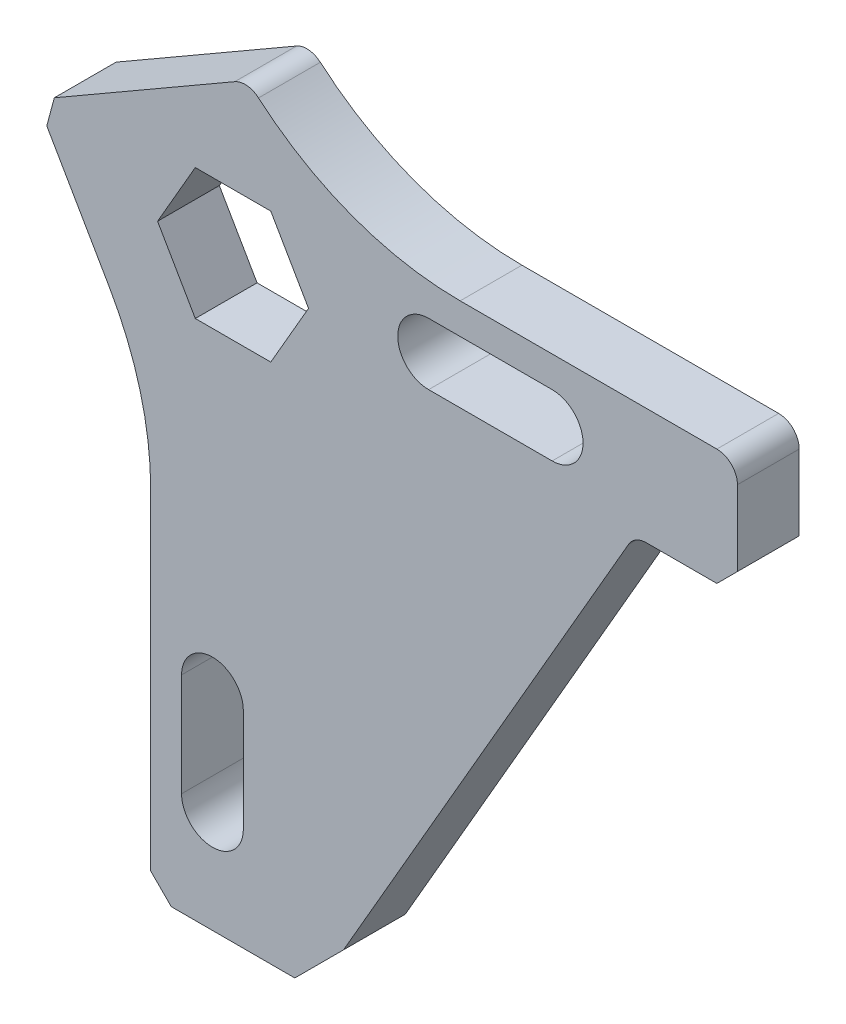
ISO-10303-21;
HEADER;
FILE_DESCRIPTION(('STEP AP214'),'2;1');
FILE_NAME('part.step','',(''),(''),'','','');
FILE_SCHEMA(('AUTOMOTIVE_DESIGN { 1 0 10303 214 1 1 1 1 }'));
ENDSEC;
DATA;
#1=APPLICATION_CONTEXT('core data for automotive mechanical design processes');
#2=APPLICATION_PROTOCOL_DEFINITION('international standard','automotive_design',2000,#1);
#3=PRODUCT_CONTEXT('',#1,'mechanical');
#4=PRODUCT('Part','Part','',(#3));
#5=PRODUCT_RELATED_PRODUCT_CATEGORY('part','',(#4));
#6=PRODUCT_DEFINITION_FORMATION('','',#4);
#7=PRODUCT_DEFINITION_CONTEXT('part definition',#1,'design');
#8=PRODUCT_DEFINITION('design','',#6,#7);
#9=PRODUCT_DEFINITION_SHAPE('','',#8);
#10=(LENGTH_UNIT() NAMED_UNIT(*) SI_UNIT(.MILLI.,.METRE.));
#11=(NAMED_UNIT(*) PLANE_ANGLE_UNIT() SI_UNIT($,.RADIAN.));
#12=(NAMED_UNIT(*) SI_UNIT($,.STERADIAN.) SOLID_ANGLE_UNIT());
#13=UNCERTAINTY_MEASURE_WITH_UNIT(LENGTH_MEASURE(1.E-05),#10,'distance_accuracy_value','');
#14=(GEOMETRIC_REPRESENTATION_CONTEXT(3) GLOBAL_UNCERTAINTY_ASSIGNED_CONTEXT((#13)) GLOBAL_UNIT_ASSIGNED_CONTEXT((#10,
#11,#12)) REPRESENTATION_CONTEXT('',''));
#15=CARTESIAN_POINT('',(0.,0.,0.));
#16=DIRECTION('',(0.,0.,1.));
#17=DIRECTION('',(1.,0.,0.));
#18=AXIS2_PLACEMENT_3D('',#15,#16,#17);
#19=CARTESIAN_POINT('',(0.,0.,6.));
#20=DIRECTION('',(0.,0.,-1.));
#21=DIRECTION('',(-1.,0.,0.));
#22=AXIS2_PLACEMENT_3D('',#19,#20,#21);
#23=PLANE('',#22);
#24=DIRECTION('',(1.,0.,0.));
#25=VECTOR('',#24,1.);
#26=CARTESIAN_POINT('',(57.,53.6935750346355,6.));
#27=LINE('',#26,#25);
#28=CARTESIAN_POINT('',(48.1547005383793,53.6935750346355,6.));
#29=VERTEX_POINT('',#28);
#30=CARTESIAN_POINT('',(55.,53.6935750346355,6.));
#31=VERTEX_POINT('',#30);
#32=EDGE_CURVE('E556',#29,#31,#27,.T.);
#33=ORIENTED_EDGE('',*,*,#32,.T.);
#34=DIRECTION('',(-0.707106781186548,-0.707106781186548,0.));
#35=VECTOR('',#34,1.);
#36=CARTESIAN_POINT('',(55.,53.6935750346355,6.));
#37=LINE('',#36,#35);
#38=CARTESIAN_POINT('',(57.,55.6935750346356,6.));
#39=VERTEX_POINT('',#38);
#40=EDGE_CURVE('E69',#31,#39,#37,.F.);
#41=ORIENTED_EDGE('',*,*,#40,.T.);
#42=DIRECTION('',(0.,1.,0.));
#43=VECTOR('',#42,1.);
#44=CARTESIAN_POINT('',(57.,65.,6.));
#45=LINE('',#44,#43);
#46=CARTESIAN_POINT('',(57.,63.,6.));
#47=VERTEX_POINT('',#46);
#48=EDGE_CURVE('E565',#39,#47,#45,.T.);
#49=ORIENTED_EDGE('',*,*,#48,.T.);
#50=CARTESIAN_POINT('',(55.,63.,6.));
#51=DIRECTION('',(0.,0.,-1.));
#52=DIRECTION('',(-1.,0.,0.));
#53=AXIS2_PLACEMENT_3D('',#50,#51,#52);
#54=CIRCLE('',#53,2.);
#55=CARTESIAN_POINT('',(55.,65.,6.));
#56=VERTEX_POINT('',#55);
#57=EDGE_CURVE('E529',#47,#56,#54,.F.);
#58=ORIENTED_EDGE('',*,*,#57,.T.);
#59=DIRECTION('',(-1.,0.,0.));
#60=VECTOR('',#59,1.);
#61=CARTESIAN_POINT('',(0.,65.,6.));
#62=LINE('',#61,#60);
#63=CARTESIAN_POINT('',(30.0632208529079,65.,6.));
#64=VERTEX_POINT('',#63);
#65=EDGE_CURVE('E419',#56,#64,#62,.T.);
#66=ORIENTED_EDGE('',*,*,#65,.T.);
#67=CARTESIAN_POINT('',(30.0632208529079,95.,6.));
#68=DIRECTION('',(0.,0.,-1.));
#69=DIRECTION('',(-1.,0.,0.));
#70=AXIS2_PLACEMENT_3D('',#67,#68,#69);
#71=CIRCLE('',#70,30.);
#72=CARTESIAN_POINT('',(10.4765964546589,72.2763527425301,6.));
#73=VERTEX_POINT('',#72);
#74=EDGE_CURVE('E450',#64,#73,#71,.T.);
#75=ORIENTED_EDGE('',*,*,#74,.T.);
#76=CARTESIAN_POINT('',(9.17082149477568,70.7614429253654,6.));
#77=DIRECTION('',(0.,0.,-1.));
#78=DIRECTION('',(-1.,0.,0.));
#79=AXIS2_PLACEMENT_3D('',#76,#77,#78);
#80=CIRCLE('',#79,2.);
#81=CARTESIAN_POINT('',(8.17082149477568,72.4934937329343,6.));
#82=VERTEX_POINT('',#81);
#83=EDGE_CURVE('E509',#73,#82,#80,.F.);
#84=ORIENTED_EDGE('',*,*,#83,.T.);
#85=DIRECTION('',(-0.866025403784439,-0.5,0.));
#86=VECTOR('',#85,1.);
#87=CARTESIAN_POINT('',(9.43116331603037,73.2211524227067,6.));
#88=LINE('',#87,#86);
#89=CARTESIAN_POINT('',(-9.36158794609195,62.3711524227066,6.));
#90=VERTEX_POINT('',#89);
#91=EDGE_CURVE('E579',#82,#90,#88,.T.);
#92=ORIENTED_EDGE('',*,*,#91,.T.);
#93=DIRECTION('',(0.258819045102517,0.965925826289069,0.));
#94=VECTOR('',#93,1.);
#95=CARTESIAN_POINT('',(-9.36158794609195,62.3711524227066,6.));
#96=LINE('',#95,#94);
#97=CARTESIAN_POINT('',(-10.0936387536608,59.6391016151378,6.));
#98=VERTEX_POINT('',#97);
#99=EDGE_CURVE('E486',#90,#98,#96,.F.);
#100=ORIENTED_EDGE('',*,*,#99,.T.);
#101=DIRECTION('',(0.5,-0.866025403784438,0.));
#102=VECTOR('',#101,1.);
#103=CARTESIAN_POINT('',(-11.0936387536608,61.3711524227066,6.));
#104=LINE('',#103,#102);
#105=CARTESIAN_POINT('',(-4.01923788646685,49.1179306876173,6.));
#106=VERTEX_POINT('',#105);
#107=EDGE_CURVE('E576',#98,#106,#104,.T.);
#108=ORIENTED_EDGE('',*,*,#107,.T.);
#109=CARTESIAN_POINT('',(-30.,34.1179306876173,6.));
#110=DIRECTION('',(0.,0.,-1.));
#111=DIRECTION('',(-1.,0.,0.));
#112=AXIS2_PLACEMENT_3D('',#109,#110,#111);
#113=CIRCLE('',#112,30.);
#114=CARTESIAN_POINT('',(0.,34.1179306876173,6.));
#115=VERTEX_POINT('',#114);
#116=EDGE_CURVE('E458',#106,#115,#113,.T.);
#117=ORIENTED_EDGE('',*,*,#116,.T.);
#118=DIRECTION('',(0.,-1.,0.));
#119=VECTOR('',#118,1.);
#120=CARTESIAN_POINT('',(0.,0.,6.));
#121=LINE('',#120,#119);
#122=CARTESIAN_POINT('',(0.,2.00000000000003,6.));
#123=VERTEX_POINT('',#122);
#124=EDGE_CURVE('E422',#115,#123,#121,.T.);
#125=ORIENTED_EDGE('',*,*,#124,.T.);
#126=DIRECTION('',(-0.707106781186545,0.70710678118655,0.));
#127=VECTOR('',#126,1.);
#128=CARTESIAN_POINT('',(2.00000000000002,0.,6.));
#129=LINE('',#128,#127);
#130=CARTESIAN_POINT('',(2.00000000000002,0.,6.));
#131=VERTEX_POINT('',#130);
#132=EDGE_CURVE('E489',#123,#131,#129,.F.);
#133=ORIENTED_EDGE('',*,*,#132,.T.);
#134=DIRECTION('',(1.,0.,0.));
#135=VECTOR('',#134,1.);
#136=CARTESIAN_POINT('',(16.,0.,6.));
#137=LINE('',#136,#135);
#138=CARTESIAN_POINT('',(14.,0.,6.));
#139=VERTEX_POINT('',#138);
#140=EDGE_CURVE('E410',#131,#139,#137,.T.);
#141=ORIENTED_EDGE('',*,*,#140,.T.);
#142=DIRECTION('',(-0.707106781186549,-0.707106781186546,0.));
#143=VECTOR('',#142,1.);
#144=CARTESIAN_POINT('',(18.7320508075689,4.73205080756887,6.));
#145=LINE('',#144,#143);
#146=CARTESIAN_POINT('',(18.7320508075689,4.73205080756885,6.));
#147=VERTEX_POINT('',#146);
#148=EDGE_CURVE('E492',#139,#147,#145,.F.);
#149=ORIENTED_EDGE('',*,*,#148,.T.);
#150=DIRECTION('',(0.499999999999998,0.86602540378444,0.));
#151=VECTOR('',#150,1.);
#152=CARTESIAN_POINT('',(47.,53.6935750346355,6.));
#153=LINE('',#152,#151);
#154=CARTESIAN_POINT('',(46.4226497308104,52.6935750346355,6.));
#155=VERTEX_POINT('',#154);
#156=EDGE_CURVE('E414',#147,#155,#153,.T.);
#157=ORIENTED_EDGE('',*,*,#156,.T.);
#158=CARTESIAN_POINT('',(48.1547005383793,51.6935750346355,6.));
#159=DIRECTION('',(0.,0.,-1.));
#160=DIRECTION('',(-1.,0.,0.));
#161=AXIS2_PLACEMENT_3D('',#158,#159,#160);
#162=CIRCLE('',#161,2.);
#163=EDGE_CURVE('E542',#155,#29,#162,.T.);
#164=ORIENTED_EDGE('',*,*,#163,.T.);
#165=EDGE_LOOP('',(#33,#41,#49,#58,#66,#75,#84,#92,#100,#108,#117,#125,#133,#141,#149,#157,#164));
#166=FACE_BOUND('',#165,.T.);
#167=CARTESIAN_POINT('',(6.,20.,6.));
#168=DIRECTION('',(0.,0.,1.));
#169=DIRECTION('',(1.,0.,0.));
#170=AXIS2_PLACEMENT_3D('',#167,#168,#169);
#171=CIRCLE('',#170,3.);
#172=CARTESIAN_POINT('',(8.99999999999999,20.,6.));
#173=VERTEX_POINT('',#172);
#174=CARTESIAN_POINT('',(3.,20.,6.));
#175=VERTEX_POINT('',#174);
#176=EDGE_CURVE('E304',#173,#175,#171,.T.);
#177=ORIENTED_EDGE('',*,*,#176,.F.);
#178=DIRECTION('',(0.,1.,0.));
#179=VECTOR('',#178,1.);
#180=CARTESIAN_POINT('',(8.99999999999999,20.,6.));
#181=LINE('',#180,#179);
#182=CARTESIAN_POINT('',(9.,10.,6.));
#183=VERTEX_POINT('',#182);
#184=EDGE_CURVE('E315',#183,#173,#181,.T.);
#185=ORIENTED_EDGE('',*,*,#184,.F.);
#186=CARTESIAN_POINT('',(6.,10.,6.));
#187=DIRECTION('',(0.,0.,1.));
#188=DIRECTION('',(1.,0.,0.));
#189=AXIS2_PLACEMENT_3D('',#186,#187,#188);
#190=CIRCLE('',#189,3.);
#191=CARTESIAN_POINT('',(3.00000000000001,10.,6.));
#192=VERTEX_POINT('',#191);
#193=EDGE_CURVE('E311',#192,#183,#190,.T.);
#194=ORIENTED_EDGE('',*,*,#193,.F.);
#195=DIRECTION('',(0.,-1.,0.));
#196=VECTOR('',#195,1.);
#197=CARTESIAN_POINT('',(3.,20.,6.));
#198=LINE('',#197,#196);
#199=EDGE_CURVE('E307',#175,#192,#198,.T.);
#200=ORIENTED_EDGE('',*,*,#199,.F.);
#201=EDGE_LOOP('',(#177,#185,#194,#200));
#202=FACE_BOUND('',#201,.T.);
#203=DIRECTION('',(0.5,-0.866025403784439,0.));
#204=VECTOR('',#203,1.);
#205=CARTESIAN_POINT('',(0.66765158129175,57.,6.));
#206=LINE('',#205,#204);
#207=CARTESIAN_POINT('',(0.66765158129175,57.,6.));
#208=VERTEX_POINT('',#207);
#209=CARTESIAN_POINT('',(4.33382579064588,50.65,6.));
#210=VERTEX_POINT('',#209);
#211=EDGE_CURVE('E347',#208,#210,#206,.T.);
#212=ORIENTED_EDGE('',*,*,#211,.F.);
#213=DIRECTION('',(-0.5,-0.866025403784439,0.));
#214=VECTOR('',#213,1.);
#215=CARTESIAN_POINT('',(4.33382579064588,63.35,6.));
#216=LINE('',#215,#214);
#217=CARTESIAN_POINT('',(4.33382579064588,63.35,6.));
#218=VERTEX_POINT('',#217);
#219=EDGE_CURVE('E364',#218,#208,#216,.T.);
#220=ORIENTED_EDGE('',*,*,#219,.F.);
#221=DIRECTION('',(-1.,0.,0.));
#222=VECTOR('',#221,1.);
#223=CARTESIAN_POINT('',(11.6661742093541,63.35,6.));
#224=LINE('',#223,#222);
#225=CARTESIAN_POINT('',(11.6661742093541,63.35,6.));
#226=VERTEX_POINT('',#225);
#227=EDGE_CURVE('E360',#226,#218,#224,.T.);
#228=ORIENTED_EDGE('',*,*,#227,.F.);
#229=DIRECTION('',(-0.5,0.866025403784438,0.));
#230=VECTOR('',#229,1.);
#231=CARTESIAN_POINT('',(15.3323484187082,57.,6.));
#232=LINE('',#231,#230);
#233=CARTESIAN_POINT('',(15.3323484187082,57.,6.));
#234=VERTEX_POINT('',#233);
#235=EDGE_CURVE('E357',#234,#226,#232,.T.);
#236=ORIENTED_EDGE('',*,*,#235,.F.);
#237=DIRECTION('',(0.5,0.866025403784439,0.));
#238=VECTOR('',#237,1.);
#239=CARTESIAN_POINT('',(11.6661742093541,50.65,6.));
#240=LINE('',#239,#238);
#241=CARTESIAN_POINT('',(11.6661742093541,50.65,6.));
#242=VERTEX_POINT('',#241);
#243=EDGE_CURVE('E354',#242,#234,#240,.T.);
#244=ORIENTED_EDGE('',*,*,#243,.F.);
#245=DIRECTION('',(1.,0.,0.));
#246=VECTOR('',#245,1.);
#247=CARTESIAN_POINT('',(4.33382579064588,50.65,6.));
#248=LINE('',#247,#246);
#249=EDGE_CURVE('E350',#210,#242,#248,.T.);
#250=ORIENTED_EDGE('',*,*,#249,.F.);
#251=EDGE_LOOP('',(#212,#220,#228,#236,#244,#250));
#252=FACE_BOUND('',#251,.T.);
#253=CARTESIAN_POINT('',(27.,59.,6.));
#254=DIRECTION('',(0.,0.,1.));
#255=DIRECTION('',(1.,0.,0.));
#256=AXIS2_PLACEMENT_3D('',#253,#254,#255);
#257=CIRCLE('',#256,3.);
#258=CARTESIAN_POINT('',(27.,62.,6.));
#259=VERTEX_POINT('',#258);
#260=CARTESIAN_POINT('',(27.,56.,6.));
#261=VERTEX_POINT('',#260);
#262=EDGE_CURVE('E249',#259,#261,#257,.T.);
#263=ORIENTED_EDGE('',*,*,#262,.F.);
#264=DIRECTION('',(-1.,0.,0.));
#265=VECTOR('',#264,1.);
#266=CARTESIAN_POINT('',(27.,62.,6.));
#267=LINE('',#266,#265);
#268=CARTESIAN_POINT('',(39.,62.,6.));
#269=VERTEX_POINT('',#268);
#270=EDGE_CURVE('E278',#269,#259,#267,.T.);
#271=ORIENTED_EDGE('',*,*,#270,.F.);
#272=CARTESIAN_POINT('',(39.,59.,6.));
#273=DIRECTION('',(0.,0.,1.));
#274=DIRECTION('',(1.,0.,0.));
#275=AXIS2_PLACEMENT_3D('',#272,#273,#274);
#276=CIRCLE('',#275,3.);
#277=CARTESIAN_POINT('',(39.,56.,6.));
#278=VERTEX_POINT('',#277);
#279=EDGE_CURVE('E274',#278,#269,#276,.T.);
#280=ORIENTED_EDGE('',*,*,#279,.F.);
#281=DIRECTION('',(1.,0.,0.));
#282=VECTOR('',#281,1.);
#283=CARTESIAN_POINT('',(27.,56.,6.));
#284=LINE('',#283,#282);
#285=EDGE_CURVE('E260',#261,#278,#284,.T.);
#286=ORIENTED_EDGE('',*,*,#285,.F.);
#287=EDGE_LOOP('',(#263,#271,#280,#286));
#288=FACE_BOUND('',#287,.T.);
#289=ADVANCED_FACE('F45',(#166,#202,#252,#288),#23,.F.);
#290=CARTESIAN_POINT('',(0.,0.,0.));
#291=DIRECTION('',(0.,0.,-1.));
#292=DIRECTION('',(-1.,0.,0.));
#293=AXIS2_PLACEMENT_3D('',#290,#291,#292);
#294=PLANE('',#293);
#295=DIRECTION('',(0.,1.,0.));
#296=VECTOR('',#295,1.);
#297=CARTESIAN_POINT('',(57.,65.,0.));
#298=LINE('',#297,#296);
#299=CARTESIAN_POINT('',(57.,55.6935750346356,0.));
#300=VERTEX_POINT('',#299);
#301=CARTESIAN_POINT('',(57.,63.,0.));
#302=VERTEX_POINT('',#301);
#303=EDGE_CURVE('E570',#300,#302,#298,.T.);
#304=ORIENTED_EDGE('',*,*,#303,.F.);
#305=DIRECTION('',(0.707106781186548,0.707106781186548,0.));
#306=VECTOR('',#305,1.);
#307=CARTESIAN_POINT('',(0.653212482682215,-0.653212482682215,0.));
#308=LINE('',#307,#306);
#309=CARTESIAN_POINT('',(55.,53.6935750346355,0.));
#310=VERTEX_POINT('',#309);
#311=EDGE_CURVE('E11',#300,#310,#308,.F.);
#312=ORIENTED_EDGE('',*,*,#311,.T.);
#313=DIRECTION('',(1.,0.,0.));
#314=VECTOR('',#313,1.);
#315=CARTESIAN_POINT('',(57.,53.6935750346355,0.));
#316=LINE('',#315,#314);
#317=CARTESIAN_POINT('',(48.1547005383793,53.6935750346355,0.));
#318=VERTEX_POINT('',#317);
#319=EDGE_CURVE('E559',#318,#310,#316,.T.);
#320=ORIENTED_EDGE('',*,*,#319,.F.);
#321=CARTESIAN_POINT('',(48.1547005383793,51.6935750346355,0.));
#322=DIRECTION('',(0.,0.,-1.));
#323=DIRECTION('',(-1.,0.,0.));
#324=AXIS2_PLACEMENT_3D('',#321,#322,#323);
#325=CIRCLE('',#324,2.);
#326=CARTESIAN_POINT('',(46.4226497308104,52.6935750346355,0.));
#327=VERTEX_POINT('',#326);
#328=EDGE_CURVE('E539',#318,#327,#325,.F.);
#329=ORIENTED_EDGE('',*,*,#328,.T.);
#330=DIRECTION('',(0.499999999999998,0.86602540378444,0.));
#331=VECTOR('',#330,1.);
#332=CARTESIAN_POINT('',(47.,53.6935750346355,0.));
#333=LINE('',#332,#331);
#334=CARTESIAN_POINT('',(18.7320508075689,4.73205080756885,0.));
#335=VERTEX_POINT('',#334);
#336=EDGE_CURVE('E430',#335,#327,#333,.T.);
#337=ORIENTED_EDGE('',*,*,#336,.F.);
#338=DIRECTION('',(0.707106781186549,0.707106781186546,0.));
#339=VECTOR('',#338,1.);
#340=CARTESIAN_POINT('',(6.99999999999995,-6.99999999999998,0.));
#341=LINE('',#340,#339);
#342=CARTESIAN_POINT('',(14.,0.,0.));
#343=VERTEX_POINT('',#342);
#344=EDGE_CURVE('E476',#335,#343,#341,.F.);
#345=ORIENTED_EDGE('',*,*,#344,.T.);
#346=DIRECTION('',(1.,0.,0.));
#347=VECTOR('',#346,1.);
#348=CARTESIAN_POINT('',(16.,0.,0.));
#349=LINE('',#348,#347);
#350=CARTESIAN_POINT('',(2.00000000000002,0.,0.));
#351=VERTEX_POINT('',#350);
#352=EDGE_CURVE('E409',#351,#343,#349,.T.);
#353=ORIENTED_EDGE('',*,*,#352,.F.);
#354=DIRECTION('',(0.707106781186545,-0.70710678118655,0.));
#355=VECTOR('',#354,1.);
#356=CARTESIAN_POINT('',(1.00000000000001,1.00000000000001,0.));
#357=LINE('',#356,#355);
#358=CARTESIAN_POINT('',(0.,2.00000000000003,0.));
#359=VERTEX_POINT('',#358);
#360=EDGE_CURVE('E473',#351,#359,#357,.F.);
#361=ORIENTED_EDGE('',*,*,#360,.T.);
#362=DIRECTION('',(0.,-1.,0.));
#363=VECTOR('',#362,1.);
#364=CARTESIAN_POINT('',(0.,0.,0.));
#365=LINE('',#364,#363);
#366=CARTESIAN_POINT('',(0.,34.1179306876173,0.));
#367=VERTEX_POINT('',#366);
#368=EDGE_CURVE('E415',#367,#359,#365,.T.);
#369=ORIENTED_EDGE('',*,*,#368,.F.);
#370=CARTESIAN_POINT('',(-30.,34.1179306876173,0.));
#371=DIRECTION('',(0.,0.,-1.));
#372=DIRECTION('',(-1.,0.,0.));
#373=AXIS2_PLACEMENT_3D('',#370,#371,#372);
#374=CIRCLE('',#373,30.);
#375=CARTESIAN_POINT('',(-4.01923788646685,49.1179306876173,0.));
#376=VERTEX_POINT('',#375);
#377=EDGE_CURVE('E461',#367,#376,#374,.F.);
#378=ORIENTED_EDGE('',*,*,#377,.T.);
#379=DIRECTION('',(0.5,-0.866025403784438,0.));
#380=VECTOR('',#379,1.);
#381=CARTESIAN_POINT('',(-11.0936387536608,61.3711524227066,0.));
#382=LINE('',#381,#380);
#383=CARTESIAN_POINT('',(-10.0936387536608,59.6391016151378,0.));
#384=VERTEX_POINT('',#383);
#385=EDGE_CURVE('E287',#384,#376,#382,.T.);
#386=ORIENTED_EDGE('',*,*,#385,.F.);
#387=DIRECTION('',(-0.258819045102517,-0.965925826289069,0.));
#388=VECTOR('',#387,1.);
#389=CARTESIAN_POINT('',(-24.3272685692613,6.5184719671885,0.));
#390=LINE('',#389,#388);
#391=CARTESIAN_POINT('',(-9.36158794609195,62.3711524227066,0.));
#392=VERTEX_POINT('',#391);
#393=EDGE_CURVE('E469',#384,#392,#390,.F.);
#394=ORIENTED_EDGE('',*,*,#393,.T.);
#395=DIRECTION('',(-0.866025403784439,-0.5,0.));
#396=VECTOR('',#395,1.);
#397=CARTESIAN_POINT('',(9.43116331603037,73.2211524227067,0.));
#398=LINE('',#397,#396);
#399=CARTESIAN_POINT('',(8.17082149477568,72.4934937329343,0.));
#400=VERTEX_POINT('',#399);
#401=EDGE_CURVE('E573',#400,#392,#398,.T.);
#402=ORIENTED_EDGE('',*,*,#401,.F.);
#403=CARTESIAN_POINT('',(9.17082149477568,70.7614429253654,0.));
#404=DIRECTION('',(0.,0.,-1.));
#405=DIRECTION('',(-1.,0.,0.));
#406=AXIS2_PLACEMENT_3D('',#403,#404,#405);
#407=CIRCLE('',#406,2.);
#408=CARTESIAN_POINT('',(10.4765964546589,72.2763527425301,0.));
#409=VERTEX_POINT('',#408);
#410=EDGE_CURVE('E515',#400,#409,#407,.T.);
#411=ORIENTED_EDGE('',*,*,#410,.T.);
#412=CARTESIAN_POINT('',(30.0632208529079,95.,0.));
#413=DIRECTION('',(0.,0.,-1.));
#414=DIRECTION('',(-1.,0.,0.));
#415=AXIS2_PLACEMENT_3D('',#412,#413,#414);
#416=CIRCLE('',#415,30.);
#417=CARTESIAN_POINT('',(30.0632208529079,65.,0.));
#418=VERTEX_POINT('',#417);
#419=EDGE_CURVE('E454',#409,#418,#416,.F.);
#420=ORIENTED_EDGE('',*,*,#419,.T.);
#421=DIRECTION('',(-1.,0.,0.));
#422=VECTOR('',#421,1.);
#423=CARTESIAN_POINT('',(0.,65.,0.));
#424=LINE('',#423,#422);
#425=CARTESIAN_POINT('',(55.,65.,0.));
#426=VERTEX_POINT('',#425);
#427=EDGE_CURVE('E434',#426,#418,#424,.T.);
#428=ORIENTED_EDGE('',*,*,#427,.F.);
#429=CARTESIAN_POINT('',(55.,63.,0.));
#430=DIRECTION('',(0.,0.,-1.));
#431=DIRECTION('',(-1.,0.,0.));
#432=AXIS2_PLACEMENT_3D('',#429,#430,#431);
#433=CIRCLE('',#432,2.);
#434=EDGE_CURVE('E535',#426,#302,#433,.T.);
#435=ORIENTED_EDGE('',*,*,#434,.T.);
#436=EDGE_LOOP('',(#304,#312,#320,#329,#337,#345,#353,#361,#369,#378,#386,#394,#402,#411,#420,
#428,#435));
#437=FACE_BOUND('',#436,.T.);
#438=DIRECTION('',(-0.5,-0.866025403784439,0.));
#439=VECTOR('',#438,1.);
#440=CARTESIAN_POINT('',(4.33382579064588,63.35,0.));
#441=LINE('',#440,#439);
#442=CARTESIAN_POINT('',(4.33382579064588,63.35,0.));
#443=VERTEX_POINT('',#442);
#444=CARTESIAN_POINT('',(0.667651581291753,57.,0.));
#445=VERTEX_POINT('',#444);
#446=EDGE_CURVE('E351',#443,#445,#441,.T.);
#447=ORIENTED_EDGE('',*,*,#446,.T.);
#448=DIRECTION('',(0.5,-0.866025403784439,0.));
#449=VECTOR('',#448,1.);
#450=CARTESIAN_POINT('',(0.66765158129175,57.,0.));
#451=LINE('',#450,#449);
#452=CARTESIAN_POINT('',(4.33382579064588,50.65,0.));
#453=VERTEX_POINT('',#452);
#454=EDGE_CURVE('E346',#445,#453,#451,.T.);
#455=ORIENTED_EDGE('',*,*,#454,.T.);
#456=DIRECTION('',(1.,0.,0.));
#457=VECTOR('',#456,1.);
#458=CARTESIAN_POINT('',(4.33382579064588,50.65,0.));
#459=LINE('',#458,#457);
#460=CARTESIAN_POINT('',(11.6661742093541,50.65,0.));
#461=VERTEX_POINT('',#460);
#462=EDGE_CURVE('E371',#453,#461,#459,.T.);
#463=ORIENTED_EDGE('',*,*,#462,.T.);
#464=DIRECTION('',(0.5,0.866025403784439,0.));
#465=VECTOR('',#464,1.);
#466=CARTESIAN_POINT('',(11.6661742093541,50.65,0.));
#467=LINE('',#466,#465);
#468=CARTESIAN_POINT('',(15.3323484187082,57.,0.));
#469=VERTEX_POINT('',#468);
#470=EDGE_CURVE('E375',#461,#469,#467,.T.);
#471=ORIENTED_EDGE('',*,*,#470,.T.);
#472=DIRECTION('',(-0.5,0.866025403784438,0.));
#473=VECTOR('',#472,1.);
#474=CARTESIAN_POINT('',(15.3323484187082,57.,0.));
#475=LINE('',#474,#473);
#476=CARTESIAN_POINT('',(11.6661742093541,63.35,0.));
#477=VERTEX_POINT('',#476);
#478=EDGE_CURVE('E379',#469,#477,#475,.T.);
#479=ORIENTED_EDGE('',*,*,#478,.T.);
#480=DIRECTION('',(-1.,0.,0.));
#481=VECTOR('',#480,1.);
#482=CARTESIAN_POINT('',(11.6661742093541,63.35,0.));
#483=LINE('',#482,#481);
#484=EDGE_CURVE('E383',#477,#443,#483,.T.);
#485=ORIENTED_EDGE('',*,*,#484,.T.);
#486=EDGE_LOOP('',(#447,#455,#463,#471,#479,#485));
#487=FACE_BOUND('',#486,.T.);
#488=DIRECTION('',(0.,1.,0.));
#489=VECTOR('',#488,1.);
#490=CARTESIAN_POINT('',(8.99999999999999,20.,0.));
#491=LINE('',#490,#489);
#492=CARTESIAN_POINT('',(9.,10.,0.));
#493=VERTEX_POINT('',#492);
#494=CARTESIAN_POINT('',(8.99999999999999,20.,0.));
#495=VERTEX_POINT('',#494);
#496=EDGE_CURVE('E308',#493,#495,#491,.T.);
#497=ORIENTED_EDGE('',*,*,#496,.T.);
#498=CARTESIAN_POINT('',(6.,20.,0.));
#499=DIRECTION('',(0.,0.,1.));
#500=DIRECTION('',(1.,0.,0.));
#501=AXIS2_PLACEMENT_3D('',#498,#499,#500);
#502=CIRCLE('',#501,3.);
#503=CARTESIAN_POINT('',(3.,20.,0.));
#504=VERTEX_POINT('',#503);
#505=EDGE_CURVE('E269',#495,#504,#502,.T.);
#506=ORIENTED_EDGE('',*,*,#505,.T.);
#507=DIRECTION('',(0.,-1.,0.));
#508=VECTOR('',#507,1.);
#509=CARTESIAN_POINT('',(3.,20.,0.));
#510=LINE('',#509,#508);
#511=CARTESIAN_POINT('',(3.00000000000001,10.,0.));
#512=VERTEX_POINT('',#511);
#513=EDGE_CURVE('E322',#504,#512,#510,.T.);
#514=ORIENTED_EDGE('',*,*,#513,.T.);
#515=CARTESIAN_POINT('',(6.,10.,0.));
#516=DIRECTION('',(0.,0.,1.));
#517=DIRECTION('',(1.,0.,0.));
#518=AXIS2_PLACEMENT_3D('',#515,#516,#517);
#519=CIRCLE('',#518,3.);
#520=EDGE_CURVE('E326',#512,#493,#519,.T.);
#521=ORIENTED_EDGE('',*,*,#520,.T.);
#522=EDGE_LOOP('',(#497,#506,#514,#521));
#523=FACE_BOUND('',#522,.T.);
#524=DIRECTION('',(-1.,0.,0.));
#525=VECTOR('',#524,1.);
#526=CARTESIAN_POINT('',(27.,62.,0.));
#527=LINE('',#526,#525);
#528=CARTESIAN_POINT('',(39.,62.,0.));
#529=VERTEX_POINT('',#528);
#530=CARTESIAN_POINT('',(27.,62.,0.));
#531=VERTEX_POINT('',#530);
#532=EDGE_CURVE('E261',#529,#531,#527,.T.);
#533=ORIENTED_EDGE('',*,*,#532,.T.);
#534=CARTESIAN_POINT('',(27.,59.,0.));
#535=DIRECTION('',(0.,0.,1.));
#536=DIRECTION('',(1.,0.,0.));
#537=AXIS2_PLACEMENT_3D('',#534,#535,#536);
#538=CIRCLE('',#537,3.);
#539=CARTESIAN_POINT('',(27.,56.,0.));
#540=VERTEX_POINT('',#539);
#541=EDGE_CURVE('E284',#531,#540,#538,.T.);
#542=ORIENTED_EDGE('',*,*,#541,.T.);
#543=DIRECTION('',(1.,0.,0.));
#544=VECTOR('',#543,1.);
#545=CARTESIAN_POINT('',(27.,56.,0.));
#546=LINE('',#545,#544);
#547=CARTESIAN_POINT('',(39.,56.,0.));
#548=VERTEX_POINT('',#547);
#549=EDGE_CURVE('E267',#540,#548,#546,.T.);
#550=ORIENTED_EDGE('',*,*,#549,.T.);
#551=CARTESIAN_POINT('',(39.,59.,0.));
#552=DIRECTION('',(0.,0.,1.));
#553=DIRECTION('',(1.,0.,0.));
#554=AXIS2_PLACEMENT_3D('',#551,#552,#553);
#555=CIRCLE('',#554,3.);
#556=EDGE_CURVE('E290',#548,#529,#555,.T.);
#557=ORIENTED_EDGE('',*,*,#556,.T.);
#558=EDGE_LOOP('',(#533,#542,#550,#557));
#559=FACE_BOUND('',#558,.T.);
#560=ADVANCED_FACE('F598',(#437,#487,#523,#559),#294,.T.);
#561=CARTESIAN_POINT('',(16.,0.,6.));
#562=DIRECTION('',(0.,1.,0.));
#563=DIRECTION('',(-1.,0.,0.));
#564=AXIS2_PLACEMENT_3D('',#561,#562,#563);
#565=PLANE('',#564);
#566=ORIENTED_EDGE('',*,*,#352,.T.);
#567=DIRECTION('',(0.,0.,1.));
#568=VECTOR('',#567,1.);
#569=CARTESIAN_POINT('',(14.,0.,6.));
#570=LINE('',#569,#568);
#571=EDGE_CURVE('E483',#343,#139,#570,.T.);
#572=ORIENTED_EDGE('',*,*,#571,.T.);
#573=ORIENTED_EDGE('',*,*,#140,.F.);
#574=DIRECTION('',(0.,0.,-1.));
#575=VECTOR('',#574,1.);
#576=CARTESIAN_POINT('',(2.00000000000002,0.,6.));
#577=LINE('',#576,#575);
#578=EDGE_CURVE('E479',#131,#351,#577,.T.);
#579=ORIENTED_EDGE('',*,*,#578,.T.);
#580=EDGE_LOOP('',(#566,#572,#573,#579));
#581=FACE_BOUND('',#580,.T.);
#582=ADVANCED_FACE('F611',(#581),#565,.F.);
#583=CARTESIAN_POINT('',(47.,53.6935750346355,6.));
#584=DIRECTION('',(-0.86602540378444,0.499999999999998,0.));
#585=DIRECTION('',(-0.499999999999998,-0.86602540378444,0.));
#586=AXIS2_PLACEMENT_3D('',#583,#584,#585);
#587=PLANE('',#586);
#588=ORIENTED_EDGE('',*,*,#336,.T.);
#589=DIRECTION('',(0.,0.,-1.));
#590=VECTOR('',#589,1.);
#591=CARTESIAN_POINT('',(46.4226497308104,52.6935750346355,6.));
#592=LINE('',#591,#590);
#593=EDGE_CURVE('E522',#327,#155,#592,.F.);
#594=ORIENTED_EDGE('',*,*,#593,.T.);
#595=ORIENTED_EDGE('',*,*,#156,.F.);
#596=DIRECTION('',(0.,0.,-1.));
#597=VECTOR('',#596,1.);
#598=CARTESIAN_POINT('',(18.7320508075689,4.73205080756886,6.));
#599=LINE('',#598,#597);
#600=EDGE_CURVE('E465',#147,#335,#599,.T.);
#601=ORIENTED_EDGE('',*,*,#600,.T.);
#602=EDGE_LOOP('',(#588,#594,#595,#601));
#603=FACE_BOUND('',#602,.T.);
#604=ADVANCED_FACE('F618',(#603),#587,.F.);
#605=CARTESIAN_POINT('',(0.,65.,6.));
#606=DIRECTION('',(0.,-1.,0.));
#607=DIRECTION('',(0.,0.,-1.));
#608=AXIS2_PLACEMENT_3D('',#605,#606,#607);
#609=PLANE('',#608);
#610=ORIENTED_EDGE('',*,*,#65,.F.);
#611=DIRECTION('',(0.,0.,1.));
#612=VECTOR('',#611,1.);
#613=CARTESIAN_POINT('',(55.,65.,0.));
#614=LINE('',#613,#612);
#615=EDGE_CURVE('E532',#56,#426,#614,.F.);
#616=ORIENTED_EDGE('',*,*,#615,.T.);
#617=ORIENTED_EDGE('',*,*,#427,.T.);
#618=DIRECTION('',(0.,0.,1.));
#619=VECTOR('',#618,1.);
#620=CARTESIAN_POINT('',(30.0632208529079,65.,6.));
#621=LINE('',#620,#619);
#622=EDGE_CURVE('E426',#418,#64,#621,.T.);
#623=ORIENTED_EDGE('',*,*,#622,.T.);
#624=EDGE_LOOP('',(#610,#616,#617,#623));
#625=FACE_BOUND('',#624,.T.);
#626=ADVANCED_FACE('F636',(#625),#609,.F.);
#627=CARTESIAN_POINT('',(0.,0.,6.));
#628=DIRECTION('',(1.,0.,0.));
#629=DIRECTION('',(0.,0.,-1.));
#630=AXIS2_PLACEMENT_3D('',#627,#628,#629);
#631=PLANE('',#630);
#632=ORIENTED_EDGE('',*,*,#368,.T.);
#633=DIRECTION('',(0.,0.,1.));
#634=VECTOR('',#633,1.);
#635=CARTESIAN_POINT('',(0.,2.00000000000003,6.));
#636=LINE('',#635,#634);
#637=EDGE_CURVE('E495',#359,#123,#636,.T.);
#638=ORIENTED_EDGE('',*,*,#637,.T.);
#639=ORIENTED_EDGE('',*,*,#124,.F.);
#640=DIRECTION('',(0.,0.,1.));
#641=VECTOR('',#640,1.);
#642=CARTESIAN_POINT('',(0.,34.1179306876173,6.));
#643=LINE('',#642,#641);
#644=EDGE_CURVE('E447',#115,#367,#643,.F.);
#645=ORIENTED_EDGE('',*,*,#644,.T.);
#646=EDGE_LOOP('',(#632,#638,#639,#645));
#647=FACE_BOUND('',#646,.T.);
#648=ADVANCED_FACE('F603',(#647),#631,.F.);
#649=CARTESIAN_POINT('',(0.66765158129175,57.,6.));
#650=DIRECTION('',(0.866025403784439,0.5,0.));
#651=DIRECTION('',(-0.5,0.866025403784439,0.));
#652=AXIS2_PLACEMENT_3D('',#649,#650,#651);
#653=PLANE('',#652);
#654=ORIENTED_EDGE('',*,*,#454,.F.);
#655=DIRECTION('',(0.,0.,-1.));
#656=VECTOR('',#655,1.);
#657=CARTESIAN_POINT('',(0.66765158129175,57.,6.));
#658=LINE('',#657,#656);
#659=EDGE_CURVE('E367',#208,#445,#658,.T.);
#660=ORIENTED_EDGE('',*,*,#659,.F.);
#661=ORIENTED_EDGE('',*,*,#211,.T.);
#662=DIRECTION('',(0.,0.,-1.));
#663=VECTOR('',#662,1.);
#664=CARTESIAN_POINT('',(4.33382579064588,50.65,6.));
#665=LINE('',#664,#663);
#666=EDGE_CURVE('E405',#210,#453,#665,.T.);
#667=ORIENTED_EDGE('',*,*,#666,.T.);
#668=EDGE_LOOP('',(#654,#660,#661,#667));
#669=FACE_BOUND('',#668,.T.);
#670=ADVANCED_FACE('F669',(#669),#653,.T.);
#671=CARTESIAN_POINT('',(4.33382579064588,50.65,6.));
#672=DIRECTION('',(0.,1.,0.));
#673=DIRECTION('',(0.,0.,1.));
#674=AXIS2_PLACEMENT_3D('',#671,#672,#673);
#675=PLANE('',#674);
#676=ORIENTED_EDGE('',*,*,#462,.F.);
#677=ORIENTED_EDGE('',*,*,#666,.F.);
#678=ORIENTED_EDGE('',*,*,#249,.T.);
#679=DIRECTION('',(0.,0.,-1.));
#680=VECTOR('',#679,1.);
#681=CARTESIAN_POINT('',(11.6661742093541,50.65,6.));
#682=LINE('',#681,#680);
#683=EDGE_CURVE('E402',#242,#461,#682,.T.);
#684=ORIENTED_EDGE('',*,*,#683,.T.);
#685=EDGE_LOOP('',(#676,#677,#678,#684));
#686=FACE_BOUND('',#685,.T.);
#687=ADVANCED_FACE('F945',(#686),#675,.T.);
#688=CARTESIAN_POINT('',(11.6661742093541,50.65,6.));
#689=DIRECTION('',(-0.866025403784439,0.5,0.));
#690=DIRECTION('',(-0.5,-0.866025403784439,0.));
#691=AXIS2_PLACEMENT_3D('',#688,#689,#690);
#692=PLANE('',#691);
#693=ORIENTED_EDGE('',*,*,#470,.F.);
#694=ORIENTED_EDGE('',*,*,#683,.F.);
#695=ORIENTED_EDGE('',*,*,#243,.T.);
#696=DIRECTION('',(0.,0.,-1.));
#697=VECTOR('',#696,1.);
#698=CARTESIAN_POINT('',(15.3323484187082,57.,6.));
#699=LINE('',#698,#697);
#700=EDGE_CURVE('E399',#234,#469,#699,.T.);
#701=ORIENTED_EDGE('',*,*,#700,.T.);
#702=EDGE_LOOP('',(#693,#694,#695,#701));
#703=FACE_BOUND('',#702,.T.);
#704=ADVANCED_FACE('F935',(#703),#692,.T.);
#705=CARTESIAN_POINT('',(15.3323484187082,57.,6.));
#706=DIRECTION('',(-0.866025403784438,-0.5,0.));
#707=DIRECTION('',(0.5,-0.866025403784438,0.));
#708=AXIS2_PLACEMENT_3D('',#705,#706,#707);
#709=PLANE('',#708);
#710=ORIENTED_EDGE('',*,*,#478,.F.);
#711=ORIENTED_EDGE('',*,*,#700,.F.);
#712=ORIENTED_EDGE('',*,*,#235,.T.);
#713=DIRECTION('',(0.,0.,-1.));
#714=VECTOR('',#713,1.);
#715=CARTESIAN_POINT('',(11.6661742093541,63.35,6.));
#716=LINE('',#715,#714);
#717=EDGE_CURVE('E396',#226,#477,#716,.T.);
#718=ORIENTED_EDGE('',*,*,#717,.T.);
#719=EDGE_LOOP('',(#710,#711,#712,#718));
#720=FACE_BOUND('',#719,.T.);
#721=ADVANCED_FACE('F925',(#720),#709,.T.);
#722=CARTESIAN_POINT('',(11.6661742093541,63.35,6.));
#723=DIRECTION('',(0.,-1.,0.));
#724=DIRECTION('',(0.,0.,-1.));
#725=AXIS2_PLACEMENT_3D('',#722,#723,#724);
#726=PLANE('',#725);
#727=ORIENTED_EDGE('',*,*,#484,.F.);
#728=ORIENTED_EDGE('',*,*,#717,.F.);
#729=ORIENTED_EDGE('',*,*,#227,.T.);
#730=DIRECTION('',(0.,0.,-1.));
#731=VECTOR('',#730,1.);
#732=CARTESIAN_POINT('',(4.33382579064588,63.35,6.));
#733=LINE('',#732,#731);
#734=EDGE_CURVE('E393',#218,#443,#733,.T.);
#735=ORIENTED_EDGE('',*,*,#734,.T.);
#736=EDGE_LOOP('',(#727,#728,#729,#735));
#737=FACE_BOUND('',#736,.T.);
#738=ADVANCED_FACE('F915',(#737),#726,.T.);
#739=CARTESIAN_POINT('',(4.33382579064588,63.35,6.));
#740=DIRECTION('',(0.866025403784439,-0.5,0.));
#741=DIRECTION('',(0.5,0.866025403784439,0.));
#742=AXIS2_PLACEMENT_3D('',#739,#740,#741);
#743=PLANE('',#742);
#744=ORIENTED_EDGE('',*,*,#446,.F.);
#745=ORIENTED_EDGE('',*,*,#734,.F.);
#746=ORIENTED_EDGE('',*,*,#219,.T.);
#747=ORIENTED_EDGE('',*,*,#659,.T.);
#748=EDGE_LOOP('',(#744,#745,#746,#747));
#749=FACE_BOUND('',#748,.T.);
#750=ADVANCED_FACE('F905',(#749),#743,.T.);
#751=CARTESIAN_POINT('',(6.,20.,6.));
#752=DIRECTION('',(0.,0.,-1.));
#753=DIRECTION('',(-1.,0.,0.));
#754=AXIS2_PLACEMENT_3D('',#751,#752,#753);
#755=CYLINDRICAL_SURFACE('',#754,3.);
#756=ORIENTED_EDGE('',*,*,#505,.F.);
#757=DIRECTION('',(0.,0.,-1.));
#758=VECTOR('',#757,1.);
#759=CARTESIAN_POINT('',(8.99999999999999,20.,6.));
#760=LINE('',#759,#758);
#761=EDGE_CURVE('E318',#173,#495,#760,.T.);
#762=ORIENTED_EDGE('',*,*,#761,.F.);
#763=ORIENTED_EDGE('',*,*,#176,.T.);
#764=DIRECTION('',(0.,0.,-1.));
#765=VECTOR('',#764,1.);
#766=CARTESIAN_POINT('',(3.,20.,6.));
#767=LINE('',#766,#765);
#768=EDGE_CURVE('E342',#175,#504,#767,.T.);
#769=ORIENTED_EDGE('',*,*,#768,.T.);
#770=EDGE_LOOP('',(#756,#762,#763,#769));
#771=FACE_BOUND('',#770,.T.);
#772=ADVANCED_FACE('F895',(#771),#755,.F.);
#773=CARTESIAN_POINT('',(3.,20.,6.));
#774=DIRECTION('',(1.,0.,0.));
#775=DIRECTION('',(0.,1.,0.));
#776=AXIS2_PLACEMENT_3D('',#773,#774,#775);
#777=PLANE('',#776);
#778=ORIENTED_EDGE('',*,*,#513,.F.);
#779=ORIENTED_EDGE('',*,*,#768,.F.);
#780=ORIENTED_EDGE('',*,*,#199,.T.);
#781=DIRECTION('',(0.,0.,-1.));
#782=VECTOR('',#781,1.);
#783=CARTESIAN_POINT('',(3.00000000000001,10.,6.));
#784=LINE('',#783,#782);
#785=EDGE_CURVE('E339',#192,#512,#784,.T.);
#786=ORIENTED_EDGE('',*,*,#785,.T.);
#787=EDGE_LOOP('',(#778,#779,#780,#786));
#788=FACE_BOUND('',#787,.T.);
#789=ADVANCED_FACE('F885',(#788),#777,.T.);
#790=CARTESIAN_POINT('',(6.,10.,6.));
#791=DIRECTION('',(0.,0.,-1.));
#792=DIRECTION('',(-1.,0.,0.));
#793=AXIS2_PLACEMENT_3D('',#790,#791,#792);
#794=CYLINDRICAL_SURFACE('',#793,3.);
#795=ORIENTED_EDGE('',*,*,#520,.F.);
#796=ORIENTED_EDGE('',*,*,#785,.F.);
#797=ORIENTED_EDGE('',*,*,#193,.T.);
#798=DIRECTION('',(0.,0.,-1.));
#799=VECTOR('',#798,1.);
#800=CARTESIAN_POINT('',(9.,10.,6.));
#801=LINE('',#800,#799);
#802=EDGE_CURVE('E336',#183,#493,#801,.T.);
#803=ORIENTED_EDGE('',*,*,#802,.T.);
#804=EDGE_LOOP('',(#795,#796,#797,#803));
#805=FACE_BOUND('',#804,.T.);
#806=ADVANCED_FACE('F875',(#805),#794,.F.);
#807=CARTESIAN_POINT('',(8.99999999999999,20.,6.));
#808=DIRECTION('',(-1.,0.,0.));
#809=DIRECTION('',(0.,-1.,0.));
#810=AXIS2_PLACEMENT_3D('',#807,#808,#809);
#811=PLANE('',#810);
#812=ORIENTED_EDGE('',*,*,#496,.F.);
#813=ORIENTED_EDGE('',*,*,#802,.F.);
#814=ORIENTED_EDGE('',*,*,#184,.T.);
#815=ORIENTED_EDGE('',*,*,#761,.T.);
#816=EDGE_LOOP('',(#812,#813,#814,#815));
#817=FACE_BOUND('',#816,.T.);
#818=ADVANCED_FACE('F866',(#817),#811,.T.);
#819=CARTESIAN_POINT('',(27.,59.,6.));
#820=DIRECTION('',(0.,0.,-1.));
#821=DIRECTION('',(-1.,0.,0.));
#822=AXIS2_PLACEMENT_3D('',#819,#820,#821);
#823=CYLINDRICAL_SURFACE('',#822,3.);
#824=ORIENTED_EDGE('',*,*,#541,.F.);
#825=DIRECTION('',(0.,0.,-1.));
#826=VECTOR('',#825,1.);
#827=CARTESIAN_POINT('',(27.,62.,6.));
#828=LINE('',#827,#826);
#829=EDGE_CURVE('E255',#259,#531,#828,.T.);
#830=ORIENTED_EDGE('',*,*,#829,.F.);
#831=ORIENTED_EDGE('',*,*,#262,.T.);
#832=DIRECTION('',(0.,0.,-1.));
#833=VECTOR('',#832,1.);
#834=CARTESIAN_POINT('',(27.,56.,6.));
#835=LINE('',#834,#833);
#836=EDGE_CURVE('E252',#261,#540,#835,.T.);
#837=ORIENTED_EDGE('',*,*,#836,.T.);
#838=EDGE_LOOP('',(#824,#830,#831,#837));
#839=FACE_BOUND('',#838,.T.);
#840=ADVANCED_FACE('F251',(#839),#823,.F.);
#841=CARTESIAN_POINT('',(27.,56.,6.));
#842=DIRECTION('',(0.,1.,0.));
#843=DIRECTION('',(0.,0.,1.));
#844=AXIS2_PLACEMENT_3D('',#841,#842,#843);
#845=PLANE('',#844);
#846=ORIENTED_EDGE('',*,*,#549,.F.);
#847=ORIENTED_EDGE('',*,*,#836,.F.);
#848=ORIENTED_EDGE('',*,*,#285,.T.);
#849=DIRECTION('',(0.,0.,-1.));
#850=VECTOR('',#849,1.);
#851=CARTESIAN_POINT('',(39.,56.,6.));
#852=LINE('',#851,#850);
#853=EDGE_CURVE('E270',#278,#548,#852,.T.);
#854=ORIENTED_EDGE('',*,*,#853,.T.);
#855=EDGE_LOOP('',(#846,#847,#848,#854));
#856=FACE_BOUND('',#855,.T.);
#857=ADVANCED_FACE('F264',(#856),#845,.T.);
#858=CARTESIAN_POINT('',(39.,59.,6.));
#859=DIRECTION('',(0.,0.,-1.));
#860=DIRECTION('',(-1.,0.,0.));
#861=AXIS2_PLACEMENT_3D('',#858,#859,#860);
#862=CYLINDRICAL_SURFACE('',#861,3.);
#863=ORIENTED_EDGE('',*,*,#556,.F.);
#864=ORIENTED_EDGE('',*,*,#853,.F.);
#865=ORIENTED_EDGE('',*,*,#279,.T.);
#866=DIRECTION('',(0.,0.,-1.));
#867=VECTOR('',#866,1.);
#868=CARTESIAN_POINT('',(39.,62.,6.));
#869=LINE('',#868,#867);
#870=EDGE_CURVE('E299',#269,#529,#869,.T.);
#871=ORIENTED_EDGE('',*,*,#870,.T.);
#872=EDGE_LOOP('',(#863,#864,#865,#871));
#873=FACE_BOUND('',#872,.T.);
#874=ADVANCED_FACE('F839',(#873),#862,.F.);
#875=CARTESIAN_POINT('',(27.,62.,6.));
#876=DIRECTION('',(0.,-1.,0.));
#877=DIRECTION('',(0.,0.,-1.));
#878=AXIS2_PLACEMENT_3D('',#875,#876,#877);
#879=PLANE('',#878);
#880=ORIENTED_EDGE('',*,*,#532,.F.);
#881=ORIENTED_EDGE('',*,*,#870,.F.);
#882=ORIENTED_EDGE('',*,*,#270,.T.);
#883=ORIENTED_EDGE('',*,*,#829,.T.);
#884=EDGE_LOOP('',(#880,#881,#882,#883));
#885=FACE_BOUND('',#884,.T.);
#886=ADVANCED_FACE('F831',(#885),#879,.T.);
#887=CARTESIAN_POINT('',(-11.0936387536608,61.3711524227066,0.));
#888=DIRECTION('',(-0.866025403784439,-0.5,0.));
#889=DIRECTION('',(0.5,-0.866025403784439,0.));
#890=AXIS2_PLACEMENT_3D('',#887,#888,#889);
#891=PLANE('',#890);
#892=ORIENTED_EDGE('',*,*,#107,.F.);
#893=DIRECTION('',(0.,0.,-1.));
#894=VECTOR('',#893,1.);
#895=CARTESIAN_POINT('',(-10.0936387536608,59.6391016151378,0.));
#896=LINE('',#895,#894);
#897=EDGE_CURVE('E502',#98,#384,#896,.T.);
#898=ORIENTED_EDGE('',*,*,#897,.T.);
#899=ORIENTED_EDGE('',*,*,#385,.T.);
#900=DIRECTION('',(0.,0.,1.));
#901=VECTOR('',#900,1.);
#902=CARTESIAN_POINT('',(-4.01923788646684,49.1179306876173,0.));
#903=LINE('',#902,#901);
#904=EDGE_CURVE('E443',#376,#106,#903,.T.);
#905=ORIENTED_EDGE('',*,*,#904,.T.);
#906=EDGE_LOOP('',(#892,#898,#899,#905));
#907=FACE_BOUND('',#906,.T.);
#908=ADVANCED_FACE('F593',(#907),#891,.T.);
#909=CARTESIAN_POINT('',(9.43116331603037,73.2211524227067,0.));
#910=DIRECTION('',(-0.5,0.866025403784438,0.));
#911=DIRECTION('',(-0.866025403784439,-0.5,0.));
#912=AXIS2_PLACEMENT_3D('',#909,#910,#911);
#913=PLANE('',#912);
#914=ORIENTED_EDGE('',*,*,#91,.F.);
#915=DIRECTION('',(0.,0.,-1.));
#916=VECTOR('',#915,1.);
#917=CARTESIAN_POINT('',(8.17082149477568,72.4934937329343,0.));
#918=LINE('',#917,#916);
#919=EDGE_CURVE('E512',#82,#400,#918,.T.);
#920=ORIENTED_EDGE('',*,*,#919,.T.);
#921=ORIENTED_EDGE('',*,*,#401,.T.);
#922=DIRECTION('',(0.,0.,1.));
#923=VECTOR('',#922,1.);
#924=CARTESIAN_POINT('',(-9.36158794609195,62.3711524227066,0.));
#925=LINE('',#924,#923);
#926=EDGE_CURVE('E498',#392,#90,#925,.T.);
#927=ORIENTED_EDGE('',*,*,#926,.T.);
#928=EDGE_LOOP('',(#914,#920,#921,#927));
#929=FACE_BOUND('',#928,.T.);
#930=ADVANCED_FACE('F646',(#929),#913,.T.);
#931=CARTESIAN_POINT('',(30.0632208529079,95.,0.));
#932=DIRECTION('',(0.,0.,1.));
#933=DIRECTION('',(1.,0.,0.));
#934=AXIS2_PLACEMENT_3D('',#931,#932,#933);
#935=CYLINDRICAL_SURFACE('',#934,30.);
#936=ORIENTED_EDGE('',*,*,#419,.F.);
#937=DIRECTION('',(0.,0.,1.));
#938=VECTOR('',#937,1.);
#939=CARTESIAN_POINT('',(10.4765964546589,72.2763527425301,0.));
#940=LINE('',#939,#938);
#941=EDGE_CURVE('E505',#409,#73,#940,.T.);
#942=ORIENTED_EDGE('',*,*,#941,.T.);
#943=ORIENTED_EDGE('',*,*,#74,.F.);
#944=ORIENTED_EDGE('',*,*,#622,.F.);
#945=EDGE_LOOP('',(#936,#942,#943,#944));
#946=FACE_BOUND('',#945,.T.);
#947=ADVANCED_FACE('F640',(#946),#935,.F.);
#948=CARTESIAN_POINT('',(-30.,34.1179306876173,0.));
#949=DIRECTION('',(0.,0.,1.));
#950=DIRECTION('',(1.,0.,0.));
#951=AXIS2_PLACEMENT_3D('',#948,#949,#950);
#952=CYLINDRICAL_SURFACE('',#951,30.);
#953=ORIENTED_EDGE('',*,*,#377,.F.);
#954=ORIENTED_EDGE('',*,*,#644,.F.);
#955=ORIENTED_EDGE('',*,*,#116,.F.);
#956=ORIENTED_EDGE('',*,*,#904,.F.);
#957=EDGE_LOOP('',(#953,#954,#955,#956));
#958=FACE_BOUND('',#957,.T.);
#959=ADVANCED_FACE('F592',(#958),#952,.F.);
#960=CARTESIAN_POINT('',(18.7320508075689,4.73205080756887,6.));
#961=DIRECTION('',(-0.707106781186546,0.707106781186549,0.));
#962=DIRECTION('',(0.,0.,-1.));
#963=AXIS2_PLACEMENT_3D('',#960,#961,#962);
#964=PLANE('',#963);
#965=ORIENTED_EDGE('',*,*,#148,.F.);
#966=ORIENTED_EDGE('',*,*,#571,.F.);
#967=ORIENTED_EDGE('',*,*,#344,.F.);
#968=ORIENTED_EDGE('',*,*,#600,.F.);
#969=EDGE_LOOP('',(#965,#966,#967,#968));
#970=FACE_BOUND('',#969,.T.);
#971=ADVANCED_FACE('F614',(#970),#964,.F.);
#972=CARTESIAN_POINT('',(2.00000000000002,0.,6.));
#973=DIRECTION('',(0.70710678118655,0.707106781186545,0.));
#974=DIRECTION('',(0.,0.,-1.));
#975=AXIS2_PLACEMENT_3D('',#972,#973,#974);
#976=PLANE('',#975);
#977=ORIENTED_EDGE('',*,*,#132,.F.);
#978=ORIENTED_EDGE('',*,*,#637,.F.);
#979=ORIENTED_EDGE('',*,*,#360,.F.);
#980=ORIENTED_EDGE('',*,*,#578,.F.);
#981=EDGE_LOOP('',(#977,#978,#979,#980));
#982=FACE_BOUND('',#981,.T.);
#983=ADVANCED_FACE('F606',(#982),#976,.F.);
#984=CARTESIAN_POINT('',(-9.36158794609195,62.3711524227066,0.));
#985=DIRECTION('',(0.965925826289069,-0.258819045102517,0.));
#986=DIRECTION('',(0.,0.,1.));
#987=AXIS2_PLACEMENT_3D('',#984,#985,#986);
#988=PLANE('',#987);
#989=ORIENTED_EDGE('',*,*,#393,.F.);
#990=ORIENTED_EDGE('',*,*,#897,.F.);
#991=ORIENTED_EDGE('',*,*,#99,.F.);
#992=ORIENTED_EDGE('',*,*,#926,.F.);
#993=EDGE_LOOP('',(#989,#990,#991,#992));
#994=FACE_BOUND('',#993,.T.);
#995=ADVANCED_FACE('F652',(#994),#988,.F.);
#996=CARTESIAN_POINT('',(9.17082149477568,70.7614429253654,0.));
#997=DIRECTION('',(0.,0.,1.));
#998=DIRECTION('',(1.,0.,0.));
#999=AXIS2_PLACEMENT_3D('',#996,#997,#998);
#1000=CYLINDRICAL_SURFACE('',#999,2.);
#1001=ORIENTED_EDGE('',*,*,#410,.F.);
#1002=ORIENTED_EDGE('',*,*,#919,.F.);
#1003=ORIENTED_EDGE('',*,*,#83,.F.);
#1004=ORIENTED_EDGE('',*,*,#941,.F.);
#1005=EDGE_LOOP('',(#1001,#1002,#1003,#1004));
#1006=FACE_BOUND('',#1005,.T.);
#1007=ADVANCED_FACE('F650',(#1006),#1000,.T.);
#1008=CARTESIAN_POINT('',(57.,65.,0.));
#1009=DIRECTION('',(1.,0.,0.));
#1010=DIRECTION('',(0.,0.,-1.));
#1011=AXIS2_PLACEMENT_3D('',#1008,#1009,#1010);
#1012=PLANE('',#1011);
#1013=ORIENTED_EDGE('',*,*,#48,.F.);
#1014=DIRECTION('',(0.,0.,-1.));
#1015=VECTOR('',#1014,1.);
#1016=CARTESIAN_POINT('',(57.,55.6935750346356,0.));
#1017=LINE('',#1016,#1015);
#1018=EDGE_CURVE('E55',#39,#300,#1017,.T.);
#1019=ORIENTED_EDGE('',*,*,#1018,.T.);
#1020=ORIENTED_EDGE('',*,*,#303,.T.);
#1021=DIRECTION('',(0.,0.,1.));
#1022=VECTOR('',#1021,1.);
#1023=CARTESIAN_POINT('',(57.,63.,6.));
#1024=LINE('',#1023,#1022);
#1025=EDGE_CURVE('E525',#302,#47,#1024,.T.);
#1026=ORIENTED_EDGE('',*,*,#1025,.T.);
#1027=EDGE_LOOP('',(#1013,#1019,#1020,#1026));
#1028=FACE_BOUND('',#1027,.T.);
#1029=ADVANCED_FACE('F625',(#1028),#1012,.T.);
#1030=CARTESIAN_POINT('',(57.,53.6935750346355,0.));
#1031=DIRECTION('',(0.,-1.,0.));
#1032=DIRECTION('',(1.,0.,0.));
#1033=AXIS2_PLACEMENT_3D('',#1030,#1031,#1032);
#1034=PLANE('',#1033);
#1035=ORIENTED_EDGE('',*,*,#319,.T.);
#1036=DIRECTION('',(0.,0.,1.));
#1037=VECTOR('',#1036,1.);
#1038=CARTESIAN_POINT('',(55.,53.6935750346355,0.));
#1039=LINE('',#1038,#1037);
#1040=EDGE_CURVE('E545',#310,#31,#1039,.T.);
#1041=ORIENTED_EDGE('',*,*,#1040,.T.);
#1042=ORIENTED_EDGE('',*,*,#32,.F.);
#1043=DIRECTION('',(0.,0.,-1.));
#1044=VECTOR('',#1043,1.);
#1045=CARTESIAN_POINT('',(48.1547005383793,53.6935750346355,0.));
#1046=LINE('',#1045,#1044);
#1047=EDGE_CURVE('E518',#29,#318,#1046,.T.);
#1048=ORIENTED_EDGE('',*,*,#1047,.T.);
#1049=EDGE_LOOP('',(#1035,#1041,#1042,#1048));
#1050=FACE_BOUND('',#1049,.T.);
#1051=ADVANCED_FACE('F555',(#1050),#1034,.T.);
#1052=CARTESIAN_POINT('',(48.1547005383793,51.6935750346355,0.));
#1053=DIRECTION('',(0.,0.,-1.));
#1054=DIRECTION('',(-1.,0.,0.));
#1055=AXIS2_PLACEMENT_3D('',#1052,#1053,#1054);
#1056=CYLINDRICAL_SURFACE('',#1055,2.);
#1057=ORIENTED_EDGE('',*,*,#163,.F.);
#1058=ORIENTED_EDGE('',*,*,#593,.F.);
#1059=ORIENTED_EDGE('',*,*,#328,.F.);
#1060=ORIENTED_EDGE('',*,*,#1047,.F.);
#1061=EDGE_LOOP('',(#1057,#1058,#1059,#1060));
#1062=FACE_BOUND('',#1061,.T.);
#1063=ADVANCED_FACE('F622',(#1062),#1056,.F.);
#1064=CARTESIAN_POINT('',(55.,63.,0.));
#1065=DIRECTION('',(0.,0.,-1.));
#1066=DIRECTION('',(-1.,0.,0.));
#1067=AXIS2_PLACEMENT_3D('',#1064,#1065,#1066);
#1068=CYLINDRICAL_SURFACE('',#1067,2.);
#1069=ORIENTED_EDGE('',*,*,#434,.F.);
#1070=ORIENTED_EDGE('',*,*,#615,.F.);
#1071=ORIENTED_EDGE('',*,*,#57,.F.);
#1072=ORIENTED_EDGE('',*,*,#1025,.F.);
#1073=EDGE_LOOP('',(#1069,#1070,#1071,#1072));
#1074=FACE_BOUND('',#1073,.T.);
#1075=ADVANCED_FACE('F632',(#1074),#1068,.T.);
#1076=CARTESIAN_POINT('',(55.,53.6935750346355,0.));
#1077=DIRECTION('',(-0.707106781186547,0.707106781186547,0.));
#1078=DIRECTION('',(0.,0.,1.));
#1079=AXIS2_PLACEMENT_3D('',#1076,#1077,#1078);
#1080=PLANE('',#1079);
#1081=ORIENTED_EDGE('',*,*,#311,.F.);
#1082=ORIENTED_EDGE('',*,*,#1018,.F.);
#1083=ORIENTED_EDGE('',*,*,#40,.F.);
#1084=ORIENTED_EDGE('',*,*,#1040,.F.);
#1085=EDGE_LOOP('',(#1081,#1082,#1083,#1084));
#1086=FACE_BOUND('',#1085,.T.);
#1087=ADVANCED_FACE('F48',(#1086),#1080,.F.);
#1088=CLOSED_SHELL('',(#289,#560,#582,#604,#626,#648,#670,#687,#704,#721,#738,#750,#772,#789,
#806,#818,#840,#857,#874,#886,#908,#930,#947,#959,#971,#983,#995,#1007,#1029,#1051,#1063,#1075,#1087));
#1089=MANIFOLD_SOLID_BREP('B2',#1088);
#1090=ADVANCED_BREP_SHAPE_REPRESENTATION('',(#18,#1089),#14);
#1091=SHAPE_DEFINITION_REPRESENTATION(#9,#1090);
ENDSEC;
END-ISO-10303-21;
